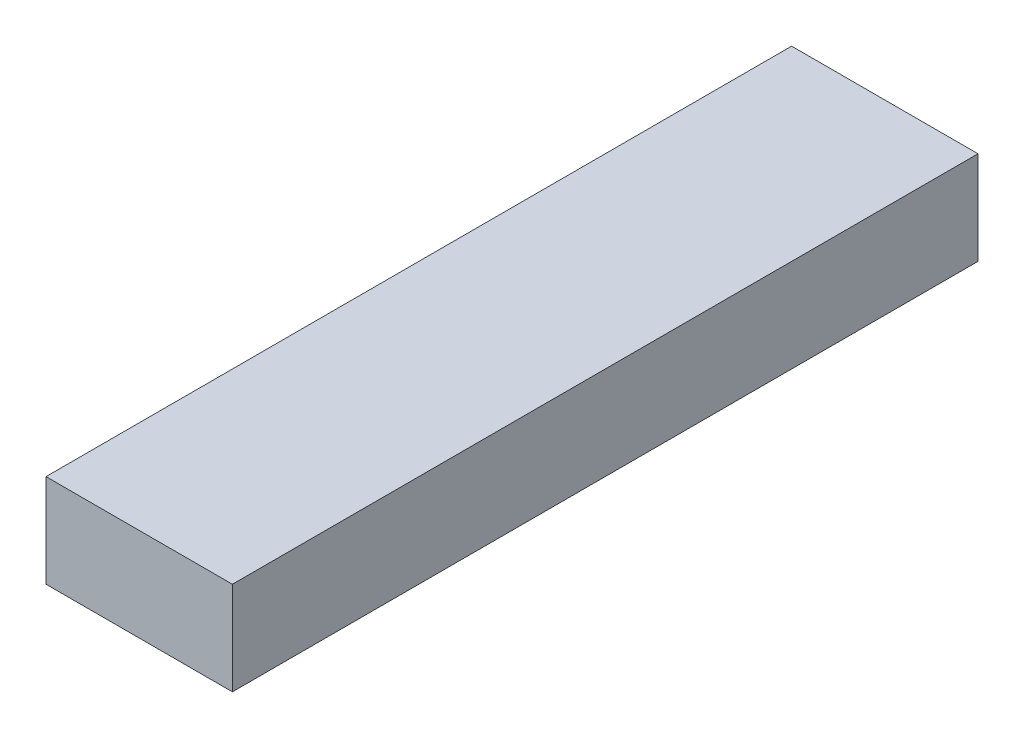
ISO-10303-21;
HEADER;
FILE_DESCRIPTION(('STEP AP214'),'2;1');
FILE_NAME('part.step','',(''),(''),'','','');
FILE_SCHEMA(('AUTOMOTIVE_DESIGN { 1 0 10303 214 1 1 1 1 }'));
ENDSEC;
DATA;
#1=APPLICATION_CONTEXT('core data for automotive mechanical design processes');
#2=APPLICATION_PROTOCOL_DEFINITION('international standard','automotive_design',2000,#1);
#3=PRODUCT_CONTEXT('',#1,'mechanical');
#4=PRODUCT('Part','Part','',(#3));
#5=PRODUCT_RELATED_PRODUCT_CATEGORY('part','',(#4));
#6=PRODUCT_DEFINITION_FORMATION('','',#4);
#7=PRODUCT_DEFINITION_CONTEXT('part definition',#1,'design');
#8=PRODUCT_DEFINITION('design','',#6,#7);
#9=PRODUCT_DEFINITION_SHAPE('','',#8);
#10=(LENGTH_UNIT() NAMED_UNIT(*) SI_UNIT(.MILLI.,.METRE.));
#11=(NAMED_UNIT(*) PLANE_ANGLE_UNIT() SI_UNIT($,.RADIAN.));
#12=(NAMED_UNIT(*) SI_UNIT($,.STERADIAN.) SOLID_ANGLE_UNIT());
#13=UNCERTAINTY_MEASURE_WITH_UNIT(LENGTH_MEASURE(1.E-05),#10,'distance_accuracy_value','');
#14=(GEOMETRIC_REPRESENTATION_CONTEXT(3) GLOBAL_UNCERTAINTY_ASSIGNED_CONTEXT((#13)) GLOBAL_UNIT_ASSIGNED_CONTEXT((#10,
#11,#12)) REPRESENTATION_CONTEXT('',''));
#15=CARTESIAN_POINT('',(0.,0.,0.));
#16=DIRECTION('',(0.,0.,1.));
#17=DIRECTION('',(1.,0.,0.));
#18=AXIS2_PLACEMENT_3D('',#15,#16,#17);
#19=CARTESIAN_POINT('',(0.,0.,0.));
#20=DIRECTION('',(0.,0.,-1.));
#21=DIRECTION('',(-1.,0.,0.));
#22=AXIS2_PLACEMENT_3D('',#19,#20,#21);
#23=PLANE('',#22);
#24=DIRECTION('',(0.,-1.,0.));
#25=VECTOR('',#24,1.);
#26=CARTESIAN_POINT('',(-5.,-2.5,0.));
#27=LINE('',#26,#25);
#28=CARTESIAN_POINT('',(-5.,2.5,0.));
#29=VERTEX_POINT('',#28);
#30=CARTESIAN_POINT('',(-5.,-2.5,0.));
#31=VERTEX_POINT('',#30);
#32=EDGE_CURVE('E80',#29,#31,#27,.T.);
#33=ORIENTED_EDGE('',*,*,#32,.F.);
#34=DIRECTION('',(-1.,0.,0.));
#35=VECTOR('',#34,1.);
#36=CARTESIAN_POINT('',(-5.,2.5,0.));
#37=LINE('',#36,#35);
#38=CARTESIAN_POINT('',(5.,2.5,0.));
#39=VERTEX_POINT('',#38);
#40=EDGE_CURVE('E82',#39,#29,#37,.T.);
#41=ORIENTED_EDGE('',*,*,#40,.F.);
#42=DIRECTION('',(0.,1.,0.));
#43=VECTOR('',#42,1.);
#44=CARTESIAN_POINT('',(5.,-2.5,0.));
#45=LINE('',#44,#43);
#46=CARTESIAN_POINT('',(5.,-2.5,0.));
#47=VERTEX_POINT('',#46);
#48=EDGE_CURVE('E84',#47,#39,#45,.T.);
#49=ORIENTED_EDGE('',*,*,#48,.F.);
#50=DIRECTION('',(1.,0.,0.));
#51=VECTOR('',#50,1.);
#52=CARTESIAN_POINT('',(-5.,-2.5,0.));
#53=LINE('',#52,#51);
#54=EDGE_CURVE('E75',#31,#47,#53,.T.);
#55=ORIENTED_EDGE('',*,*,#54,.F.);
#56=EDGE_LOOP('',(#33,#41,#49,#55));
#57=FACE_BOUND('',#56,.T.);
#58=ADVANCED_FACE('F45',(#57),#23,.T.);
#59=CARTESIAN_POINT('',(0.,0.,40.));
#60=DIRECTION('',(0.,0.,-1.));
#61=DIRECTION('',(-1.,0.,0.));
#62=AXIS2_PLACEMENT_3D('',#59,#60,#61);
#63=PLANE('',#62);
#64=DIRECTION('',(0.,-1.,0.));
#65=VECTOR('',#64,1.);
#66=CARTESIAN_POINT('',(-5.,-2.5,40.));
#67=LINE('',#66,#65);
#68=CARTESIAN_POINT('',(-5.,2.5,40.));
#69=VERTEX_POINT('',#68);
#70=CARTESIAN_POINT('',(-5.,-2.5,40.));
#71=VERTEX_POINT('',#70);
#72=EDGE_CURVE('E54',#69,#71,#67,.T.);
#73=ORIENTED_EDGE('',*,*,#72,.T.);
#74=DIRECTION('',(1.,0.,0.));
#75=VECTOR('',#74,1.);
#76=CARTESIAN_POINT('',(-5.,-2.5,40.));
#77=LINE('',#76,#75);
#78=CARTESIAN_POINT('',(5.,-2.5,40.));
#79=VERTEX_POINT('',#78);
#80=EDGE_CURVE('E11',#71,#79,#77,.T.);
#81=ORIENTED_EDGE('',*,*,#80,.T.);
#82=DIRECTION('',(0.,1.,0.));
#83=VECTOR('',#82,1.);
#84=CARTESIAN_POINT('',(5.,-2.5,40.));
#85=LINE('',#84,#83);
#86=CARTESIAN_POINT('',(5.,2.5,40.));
#87=VERTEX_POINT('',#86);
#88=EDGE_CURVE('E98',#79,#87,#85,.T.);
#89=ORIENTED_EDGE('',*,*,#88,.T.);
#90=DIRECTION('',(-1.,0.,0.));
#91=VECTOR('',#90,1.);
#92=CARTESIAN_POINT('',(-5.,2.5,40.));
#93=LINE('',#92,#91);
#94=EDGE_CURVE('E63',#87,#69,#93,.T.);
#95=ORIENTED_EDGE('',*,*,#94,.T.);
#96=EDGE_LOOP('',(#73,#81,#89,#95));
#97=FACE_BOUND('',#96,.T.);
#98=ADVANCED_FACE('F123',(#97),#63,.F.);
#99=CARTESIAN_POINT('',(5.,-2.5,0.));
#100=DIRECTION('',(1.,0.,0.));
#101=DIRECTION('',(0.,0.,-1.));
#102=AXIS2_PLACEMENT_3D('',#99,#100,#101);
#103=PLANE('',#102);
#104=DIRECTION('',(0.,0.,1.));
#105=VECTOR('',#104,1.);
#106=CARTESIAN_POINT('',(5.,2.5,0.));
#107=LINE('',#106,#105);
#108=EDGE_CURVE('E99',#39,#87,#107,.T.);
#109=ORIENTED_EDGE('',*,*,#108,.T.);
#110=ORIENTED_EDGE('',*,*,#88,.F.);
#111=DIRECTION('',(0.,0.,1.));
#112=VECTOR('',#111,1.);
#113=CARTESIAN_POINT('',(5.,-2.5,0.));
#114=LINE('',#113,#112);
#115=EDGE_CURVE('E94',#47,#79,#114,.T.);
#116=ORIENTED_EDGE('',*,*,#115,.F.);
#117=ORIENTED_EDGE('',*,*,#48,.T.);
#118=EDGE_LOOP('',(#109,#110,#116,#117));
#119=FACE_BOUND('',#118,.T.);
#120=ADVANCED_FACE('F100',(#119),#103,.T.);
#121=CARTESIAN_POINT('',(-5.,2.5,0.));
#122=DIRECTION('',(0.,1.,0.));
#123=DIRECTION('',(0.,0.,1.));
#124=AXIS2_PLACEMENT_3D('',#121,#122,#123);
#125=PLANE('',#124);
#126=DIRECTION('',(0.,0.,1.));
#127=VECTOR('',#126,1.);
#128=CARTESIAN_POINT('',(-5.,2.5,0.));
#129=LINE('',#128,#127);
#130=EDGE_CURVE('E106',#29,#69,#129,.T.);
#131=ORIENTED_EDGE('',*,*,#130,.T.);
#132=ORIENTED_EDGE('',*,*,#94,.F.);
#133=ORIENTED_EDGE('',*,*,#108,.F.);
#134=ORIENTED_EDGE('',*,*,#40,.T.);
#135=EDGE_LOOP('',(#131,#132,#133,#134));
#136=FACE_BOUND('',#135,.T.);
#137=ADVANCED_FACE('F113',(#136),#125,.T.);
#138=CARTESIAN_POINT('',(-5.,-2.5,0.));
#139=DIRECTION('',(-1.,0.,0.));
#140=DIRECTION('',(0.,0.,1.));
#141=AXIS2_PLACEMENT_3D('',#138,#139,#140);
#142=PLANE('',#141);
#143=DIRECTION('',(0.,0.,1.));
#144=VECTOR('',#143,1.);
#145=CARTESIAN_POINT('',(-5.,-2.5,0.));
#146=LINE('',#145,#144);
#147=EDGE_CURVE('E47',#31,#71,#146,.T.);
#148=ORIENTED_EDGE('',*,*,#147,.T.);
#149=ORIENTED_EDGE('',*,*,#72,.F.);
#150=ORIENTED_EDGE('',*,*,#130,.F.);
#151=ORIENTED_EDGE('',*,*,#32,.T.);
#152=EDGE_LOOP('',(#148,#149,#150,#151));
#153=FACE_BOUND('',#152,.T.);
#154=ADVANCED_FACE('F115',(#153),#142,.T.);
#155=CARTESIAN_POINT('',(-5.,-2.5,0.));
#156=DIRECTION('',(0.,-1.,0.));
#157=DIRECTION('',(0.,0.,-1.));
#158=AXIS2_PLACEMENT_3D('',#155,#156,#157);
#159=PLANE('',#158);
#160=ORIENTED_EDGE('',*,*,#80,.F.);
#161=ORIENTED_EDGE('',*,*,#147,.F.);
#162=ORIENTED_EDGE('',*,*,#54,.T.);
#163=ORIENTED_EDGE('',*,*,#115,.T.);
#164=EDGE_LOOP('',(#160,#161,#162,#163));
#165=FACE_BOUND('',#164,.T.);
#166=ADVANCED_FACE('F91',(#165),#159,.T.);
#167=CLOSED_SHELL('',(#58,#98,#120,#137,#154,#166));
#168=MANIFOLD_SOLID_BREP('B2',#167);
#169=ADVANCED_BREP_SHAPE_REPRESENTATION('',(#18,#168),#14);
#170=SHAPE_DEFINITION_REPRESENTATION(#9,#169);
ENDSEC;
END-ISO-10303-21;
